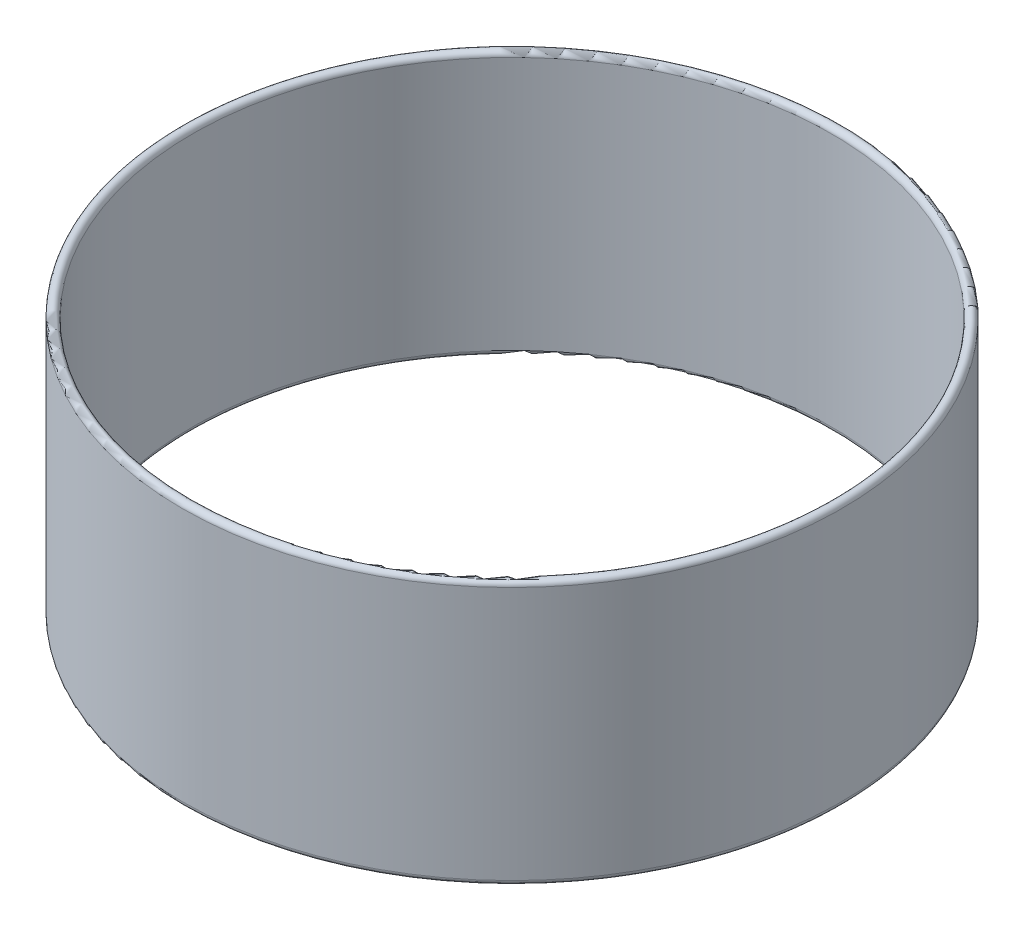
ISO-10303-21;
HEADER;
FILE_DESCRIPTION(('STEP AP214'),'2;1');
FILE_NAME('part.step','',(''),(''),'','','');
FILE_SCHEMA(('AUTOMOTIVE_DESIGN { 1 0 10303 214 1 1 1 1 }'));
ENDSEC;
DATA;
#1=APPLICATION_CONTEXT('core data for automotive mechanical design processes');
#2=APPLICATION_PROTOCOL_DEFINITION('international standard','automotive_design',2000,#1);
#3=PRODUCT_CONTEXT('',#1,'mechanical');
#4=PRODUCT('Part','Part','',(#3));
#5=PRODUCT_RELATED_PRODUCT_CATEGORY('part','',(#4));
#6=PRODUCT_DEFINITION_FORMATION('','',#4);
#7=PRODUCT_DEFINITION_CONTEXT('part definition',#1,'design');
#8=PRODUCT_DEFINITION('design','',#6,#7);
#9=PRODUCT_DEFINITION_SHAPE('','',#8);
#10=(LENGTH_UNIT() NAMED_UNIT(*) SI_UNIT(.MILLI.,.METRE.));
#11=(NAMED_UNIT(*) PLANE_ANGLE_UNIT() SI_UNIT($,.RADIAN.));
#12=(NAMED_UNIT(*) SI_UNIT($,.STERADIAN.) SOLID_ANGLE_UNIT());
#13=UNCERTAINTY_MEASURE_WITH_UNIT(LENGTH_MEASURE(1.E-05),#10,'distance_accuracy_value','');
#14=(GEOMETRIC_REPRESENTATION_CONTEXT(3) GLOBAL_UNCERTAINTY_ASSIGNED_CONTEXT((#13)) GLOBAL_UNIT_ASSIGNED_CONTEXT((#10,
#11,#12)) REPRESENTATION_CONTEXT('',''));
#15=CARTESIAN_POINT('',(0.,0.,0.));
#16=DIRECTION('',(0.,0.,1.));
#17=DIRECTION('',(1.,0.,0.));
#18=AXIS2_PLACEMENT_3D('',#15,#16,#17);
#19=CARTESIAN_POINT('',(0.,1.5,0.));
#20=DIRECTION('',(0.,1.,0.));
#21=DIRECTION('',(0.,0.,1.));
#22=AXIS2_PLACEMENT_3D('',#19,#20,#21);
#23=TOROIDAL_SURFACE('',#22,98.5,1.5);
#24=CARTESIAN_POINT('',(0.,1.5,0.));
#25=DIRECTION('',(0.,1.,0.));
#26=DIRECTION('',(0.,0.,1.));
#27=AXIS2_PLACEMENT_3D('',#24,#25,#26);
#28=CIRCLE('',#27,97.);
#29=CARTESIAN_POINT('',(0.,1.5,97.));
#30=VERTEX_POINT('',#29);
#31=EDGE_CURVE('E46',#30,#30,#28,.F.);
#32=ORIENTED_EDGE('',*,*,#31,.F.);
#33=EDGE_LOOP('',(#32));
#34=FACE_BOUND('',#33,.T.);
#35=CARTESIAN_POINT('',(0.,1.5,0.));
#36=DIRECTION('',(0.,1.,0.));
#37=DIRECTION('',(0.,0.,1.));
#38=AXIS2_PLACEMENT_3D('',#35,#36,#37);
#39=CIRCLE('',#38,100.);
#40=CARTESIAN_POINT('',(0.,1.5,100.));
#41=VERTEX_POINT('',#40);
#42=EDGE_CURVE('E10',#41,#41,#39,.T.);
#43=ORIENTED_EDGE('',*,*,#42,.F.);
#44=EDGE_LOOP('',(#43));
#45=FACE_BOUND('',#44,.T.);
#46=ADVANCED_FACE('F38',(#34,#45),#23,.T.);
#47=CARTESIAN_POINT('',(0.,78.5,0.));
#48=DIRECTION('',(0.,1.,0.));
#49=DIRECTION('',(0.,0.,1.));
#50=AXIS2_PLACEMENT_3D('',#47,#48,#49);
#51=TOROIDAL_SURFACE('',#50,98.5,1.5);
#52=CARTESIAN_POINT('',(0.,78.5,0.));
#53=DIRECTION('',(0.,1.,0.));
#54=DIRECTION('',(0.,0.,1.));
#55=AXIS2_PLACEMENT_3D('',#52,#53,#54);
#56=CIRCLE('',#55,97.);
#57=CARTESIAN_POINT('',(0.,78.5,97.));
#58=VERTEX_POINT('',#57);
#59=EDGE_CURVE('E56',#58,#58,#56,.T.);
#60=ORIENTED_EDGE('',*,*,#59,.F.);
#61=EDGE_LOOP('',(#60));
#62=FACE_BOUND('',#61,.T.);
#63=CARTESIAN_POINT('',(0.,78.5,0.));
#64=DIRECTION('',(0.,1.,0.));
#65=DIRECTION('',(0.,0.,1.));
#66=AXIS2_PLACEMENT_3D('',#63,#64,#65);
#67=CIRCLE('',#66,100.);
#68=CARTESIAN_POINT('',(0.,78.5,100.));
#69=VERTEX_POINT('',#68);
#70=EDGE_CURVE('E51',#69,#69,#67,.F.);
#71=ORIENTED_EDGE('',*,*,#70,.F.);
#72=EDGE_LOOP('',(#71));
#73=FACE_BOUND('',#72,.T.);
#74=ADVANCED_FACE('F65',(#62,#73),#51,.T.);
#75=CARTESIAN_POINT('',(0.,80.,0.));
#76=DIRECTION('',(0.,-1.,0.));
#77=DIRECTION('',(0.,0.,-1.));
#78=AXIS2_PLACEMENT_3D('',#75,#76,#77);
#79=CYLINDRICAL_SURFACE('',#78,100.);
#80=ORIENTED_EDGE('',*,*,#42,.T.);
#81=EDGE_LOOP('',(#80));
#82=FACE_BOUND('',#81,.T.);
#83=ORIENTED_EDGE('',*,*,#70,.T.);
#84=EDGE_LOOP('',(#83));
#85=FACE_BOUND('',#84,.T.);
#86=ADVANCED_FACE('F68',(#82,#85),#79,.T.);
#87=CARTESIAN_POINT('',(0.,80.,0.));
#88=DIRECTION('',(0.,-1.,0.));
#89=DIRECTION('',(0.,0.,-1.));
#90=AXIS2_PLACEMENT_3D('',#87,#88,#89);
#91=CYLINDRICAL_SURFACE('',#90,97.);
#92=ORIENTED_EDGE('',*,*,#31,.T.);
#93=EDGE_LOOP('',(#92));
#94=FACE_BOUND('',#93,.T.);
#95=ORIENTED_EDGE('',*,*,#59,.T.);
#96=EDGE_LOOP('',(#95));
#97=FACE_BOUND('',#96,.T.);
#98=ADVANCED_FACE('F63',(#94,#97),#91,.F.);
#99=CLOSED_SHELL('',(#46,#74,#86,#98));
#100=MANIFOLD_SOLID_BREP('B2',#99);
#101=ADVANCED_BREP_SHAPE_REPRESENTATION('',(#18,#100),#14);
#102=SHAPE_DEFINITION_REPRESENTATION(#9,#101);
ENDSEC;
END-ISO-10303-21;
